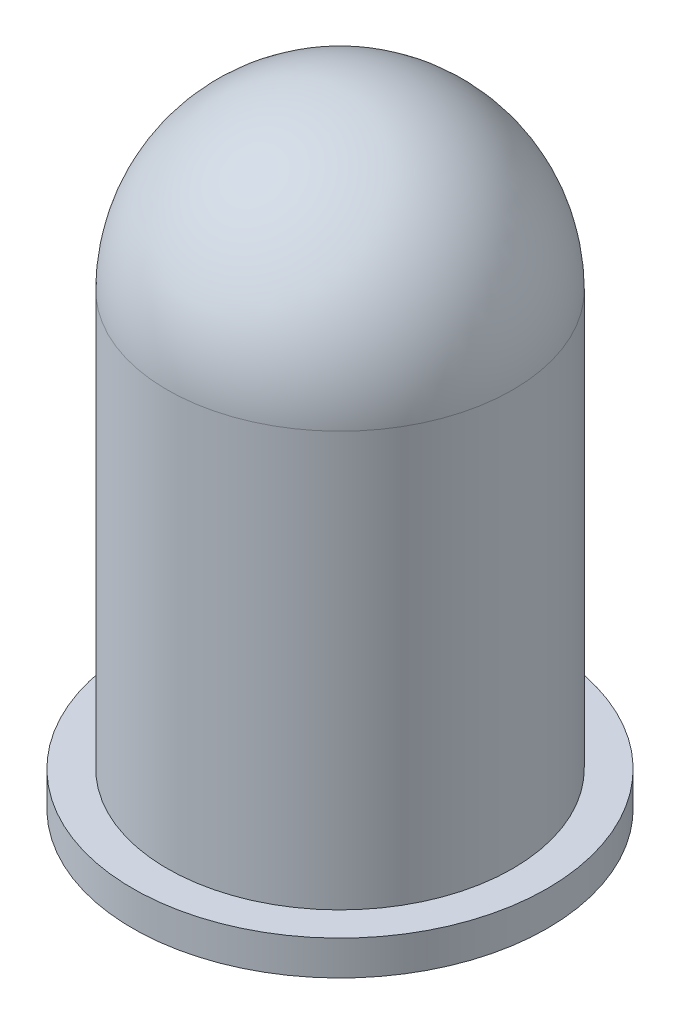
ISO-10303-21;
HEADER;
FILE_DESCRIPTION(('STEP AP214'),'2;1');
FILE_NAME('part.step','',(''),(''),'','','');
FILE_SCHEMA(('AUTOMOTIVE_DESIGN { 1 0 10303 214 1 1 1 1 }'));
ENDSEC;
DATA;
#1=APPLICATION_CONTEXT('core data for automotive mechanical design processes');
#2=APPLICATION_PROTOCOL_DEFINITION('international standard','automotive_design',2000,#1);
#3=PRODUCT_CONTEXT('',#1,'mechanical');
#4=PRODUCT('Part','Part','',(#3));
#5=PRODUCT_RELATED_PRODUCT_CATEGORY('part','',(#4));
#6=PRODUCT_DEFINITION_FORMATION('','',#4);
#7=PRODUCT_DEFINITION_CONTEXT('part definition',#1,'design');
#8=PRODUCT_DEFINITION('design','',#6,#7);
#9=PRODUCT_DEFINITION_SHAPE('','',#8);
#10=(LENGTH_UNIT() NAMED_UNIT(*) SI_UNIT(.MILLI.,.METRE.));
#11=(NAMED_UNIT(*) PLANE_ANGLE_UNIT() SI_UNIT($,.RADIAN.));
#12=(NAMED_UNIT(*) SI_UNIT($,.STERADIAN.) SOLID_ANGLE_UNIT());
#13=UNCERTAINTY_MEASURE_WITH_UNIT(LENGTH_MEASURE(1.E-05),#10,'distance_accuracy_value','');
#14=(GEOMETRIC_REPRESENTATION_CONTEXT(3) GLOBAL_UNCERTAINTY_ASSIGNED_CONTEXT((#13)) GLOBAL_UNIT_ASSIGNED_CONTEXT((#10,
#11,#12)) REPRESENTATION_CONTEXT('',''));
#15=CARTESIAN_POINT('',(0.,0.,0.));
#16=DIRECTION('',(0.,0.,1.));
#17=DIRECTION('',(1.,0.,0.));
#18=AXIS2_PLACEMENT_3D('',#15,#16,#17);
#19=CARTESIAN_POINT('',(0.,0.,0.));
#20=DIRECTION('',(0.,1.,0.));
#21=DIRECTION('',(-1.,0.,0.));
#22=AXIS2_PLACEMENT_3D('',#19,#20,#21);
#23=PLANE('',#22);
#24=CARTESIAN_POINT('',(0.,0.,0.));
#25=DIRECTION('',(0.,-1.,0.));
#26=DIRECTION('',(1.,0.,0.));
#27=AXIS2_PLACEMENT_3D('',#24,#25,#26);
#28=CIRCLE('',#27,3.);
#29=CARTESIAN_POINT('',(3.,0.,0.));
#30=VERTEX_POINT('',#29);
#31=EDGE_CURVE('E10',#30,#30,#28,.T.);
#32=ORIENTED_EDGE('',*,*,#31,.T.);
#33=EDGE_LOOP('',(#32));
#34=FACE_BOUND('',#33,.T.);
#35=ADVANCED_FACE('F31',(#34),#23,.F.);
#36=CARTESIAN_POINT('',(2.17878385817274E-12,-624.028498715866,0.));
#37=DIRECTION('',(0.,-1.,0.));
#38=DIRECTION('',(1.,0.,0.));
#39=AXIS2_PLACEMENT_3D('',#36,#37,#38);
#40=CYLINDRICAL_SURFACE('',#39,3.);
#41=ORIENTED_EDGE('',*,*,#31,.F.);
#42=EDGE_LOOP('',(#41));
#43=FACE_BOUND('',#42,.T.);
#44=CARTESIAN_POINT('',(0.,0.499999999999945,0.));
#45=DIRECTION('',(0.,-1.,0.));
#46=DIRECTION('',(1.,0.,0.));
#47=AXIS2_PLACEMENT_3D('',#44,#45,#46);
#48=CIRCLE('',#47,3.);
#49=CARTESIAN_POINT('',(3.,0.499999999999955,0.));
#50=VERTEX_POINT('',#49);
#51=EDGE_CURVE('E37',#50,#50,#48,.T.);
#52=ORIENTED_EDGE('',*,*,#51,.T.);
#53=EDGE_LOOP('',(#52));
#54=FACE_BOUND('',#53,.T.);
#55=ADVANCED_FACE('F63',(#43,#54),#40,.T.);
#56=CARTESIAN_POINT('',(-3.,0.499999999999999,0.));
#57=DIRECTION('',(0.,-1.,0.));
#58=DIRECTION('',(1.,0.,0.));
#59=AXIS2_PLACEMENT_3D('',#56,#57,#58);
#60=PLANE('',#59);
#61=ORIENTED_EDGE('',*,*,#51,.F.);
#62=EDGE_LOOP('',(#61));
#63=FACE_BOUND('',#62,.T.);
#64=CARTESIAN_POINT('',(0.,0.499999999999945,0.));
#65=DIRECTION('',(0.,-1.,0.));
#66=DIRECTION('',(1.,0.,0.));
#67=AXIS2_PLACEMENT_3D('',#64,#65,#66);
#68=CIRCLE('',#67,2.5);
#69=CARTESIAN_POINT('',(2.5,0.499999999999954,0.));
#70=VERTEX_POINT('',#69);
#71=EDGE_CURVE('E41',#70,#70,#68,.T.);
#72=ORIENTED_EDGE('',*,*,#71,.T.);
#73=EDGE_LOOP('',(#72));
#74=FACE_BOUND('',#73,.T.);
#75=ADVANCED_FACE('F59',(#63,#74),#60,.F.);
#76=CARTESIAN_POINT('',(2.17878385817274E-12,-624.028498715866,0.));
#77=DIRECTION('',(0.,-1.,0.));
#78=DIRECTION('',(1.,0.,0.));
#79=AXIS2_PLACEMENT_3D('',#76,#77,#78);
#80=CYLINDRICAL_SURFACE('',#79,2.49999999999999);
#81=ORIENTED_EDGE('',*,*,#71,.F.);
#82=EDGE_LOOP('',(#81));
#83=FACE_BOUND('',#82,.T.);
#84=CARTESIAN_POINT('',(0.,6.49999999999995,0.));
#85=DIRECTION('',(0.,-1.,0.));
#86=DIRECTION('',(1.,0.,0.));
#87=AXIS2_PLACEMENT_3D('',#84,#85,#86);
#88=CIRCLE('',#87,2.49999999999998);
#89=CARTESIAN_POINT('',(2.49999999999995,6.49999999999996,0.));
#90=VERTEX_POINT('',#89);
#91=EDGE_CURVE('E45',#90,#90,#88,.T.);
#92=ORIENTED_EDGE('',*,*,#91,.T.);
#93=EDGE_LOOP('',(#92));
#94=FACE_BOUND('',#93,.T.);
#95=ADVANCED_FACE('F51',(#83,#94),#80,.T.);
#96=CARTESIAN_POINT('',(0.,6.5,0.));
#97=DIRECTION('',(0.,-1.,0.));
#98=DIRECTION('',(1.,0.,0.));
#99=AXIS2_PLACEMENT_3D('',#96,#97,#98);
#100=SPHERICAL_SURFACE('',#99,2.5);
#101=ORIENTED_EDGE('',*,*,#91,.F.);
#102=EDGE_LOOP('',(#101));
#103=FACE_BOUND('',#102,.T.);
#104=ADVANCED_FACE('F53',(#103),#100,.T.);
#105=CLOSED_SHELL('',(#35,#55,#75,#95,#104));
#106=MANIFOLD_SOLID_BREP('B2',#105);
#107=ADVANCED_BREP_SHAPE_REPRESENTATION('',(#18,#106),#14);
#108=SHAPE_DEFINITION_REPRESENTATION(#9,#107);
ENDSEC;
END-ISO-10303-21;
